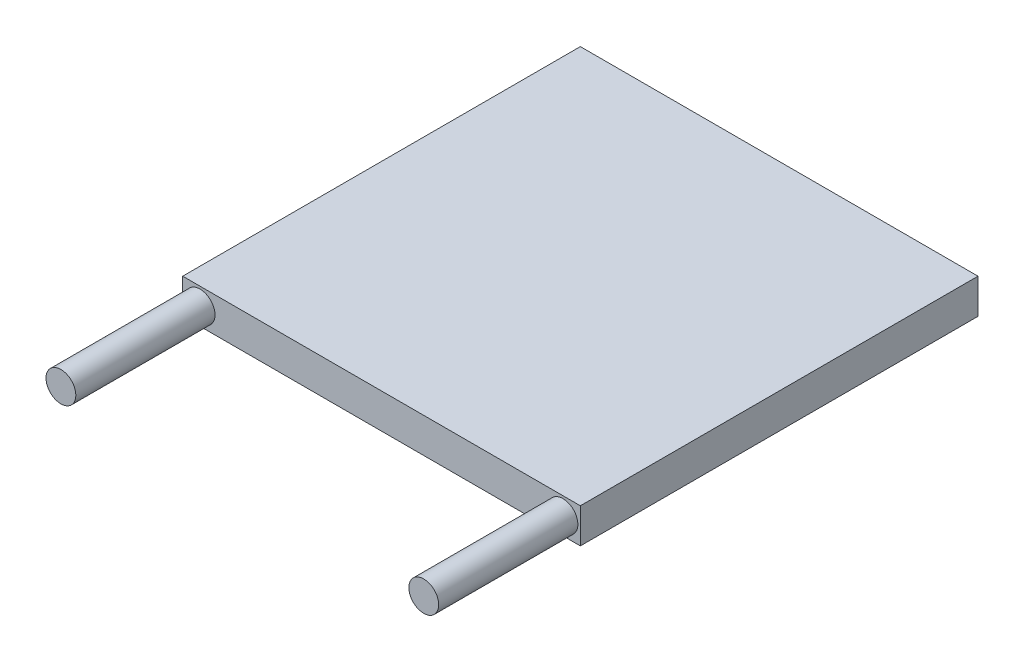
ISO-10303-21;
HEADER;
FILE_DESCRIPTION(('STEP AP214'),'2;1');
FILE_NAME('part.step','',(''),(''),'','','');
FILE_SCHEMA(('AUTOMOTIVE_DESIGN { 1 0 10303 214 1 1 1 1 }'));
ENDSEC;
DATA;
#1=APPLICATION_CONTEXT('core data for automotive mechanical design processes');
#2=APPLICATION_PROTOCOL_DEFINITION('international standard','automotive_design',2000,#1);
#3=PRODUCT_CONTEXT('',#1,'mechanical');
#4=PRODUCT('Part','Part','',(#3));
#5=PRODUCT_RELATED_PRODUCT_CATEGORY('part','',(#4));
#6=PRODUCT_DEFINITION_FORMATION('','',#4);
#7=PRODUCT_DEFINITION_CONTEXT('part definition',#1,'design');
#8=PRODUCT_DEFINITION('design','',#6,#7);
#9=PRODUCT_DEFINITION_SHAPE('','',#8);
#10=(LENGTH_UNIT() NAMED_UNIT(*) SI_UNIT(.MILLI.,.METRE.));
#11=(NAMED_UNIT(*) PLANE_ANGLE_UNIT() SI_UNIT($,.RADIAN.));
#12=(NAMED_UNIT(*) SI_UNIT($,.STERADIAN.) SOLID_ANGLE_UNIT());
#13=UNCERTAINTY_MEASURE_WITH_UNIT(LENGTH_MEASURE(1.E-05),#10,'distance_accuracy_value','');
#14=(GEOMETRIC_REPRESENTATION_CONTEXT(3) GLOBAL_UNCERTAINTY_ASSIGNED_CONTEXT((#13)) GLOBAL_UNIT_ASSIGNED_CONTEXT((#10,
#11,#12)) REPRESENTATION_CONTEXT('',''));
#15=CARTESIAN_POINT('',(0.,0.,0.));
#16=DIRECTION('',(0.,0.,1.));
#17=DIRECTION('',(1.,0.,0.));
#18=AXIS2_PLACEMENT_3D('',#15,#16,#17);
#19=CARTESIAN_POINT('',(20.,3.5,20.));
#20=DIRECTION('',(-1.,0.,0.));
#21=DIRECTION('',(0.,0.,1.));
#22=AXIS2_PLACEMENT_3D('',#19,#20,#21);
#23=PLANE('',#22);
#24=DIRECTION('',(0.,0.,-1.));
#25=VECTOR('',#24,1.);
#26=CARTESIAN_POINT('',(20.,0.,20.));
#27=LINE('',#26,#25);
#28=CARTESIAN_POINT('',(20.,0.,20.));
#29=VERTEX_POINT('',#28);
#30=CARTESIAN_POINT('',(20.,0.,-20.));
#31=VERTEX_POINT('',#30);
#32=EDGE_CURVE('E114',#29,#31,#27,.T.);
#33=ORIENTED_EDGE('',*,*,#32,.T.);
#34=DIRECTION('',(0.,-1.,0.));
#35=VECTOR('',#34,1.);
#36=CARTESIAN_POINT('',(20.,3.5,-20.));
#37=LINE('',#36,#35);
#38=CARTESIAN_POINT('',(20.,3.5,-20.));
#39=VERTEX_POINT('',#38);
#40=EDGE_CURVE('E52',#39,#31,#37,.T.);
#41=ORIENTED_EDGE('',*,*,#40,.F.);
#42=DIRECTION('',(0.,0.,-1.));
#43=VECTOR('',#42,1.);
#44=CARTESIAN_POINT('',(20.,3.5,20.));
#45=LINE('',#44,#43);
#46=CARTESIAN_POINT('',(20.,3.5,20.));
#47=VERTEX_POINT('',#46);
#48=EDGE_CURVE('E96',#47,#39,#45,.T.);
#49=ORIENTED_EDGE('',*,*,#48,.F.);
#50=DIRECTION('',(0.,-1.,0.));
#51=VECTOR('',#50,1.);
#52=CARTESIAN_POINT('',(20.,3.5,20.));
#53=LINE('',#52,#51);
#54=EDGE_CURVE('E110',#47,#29,#53,.T.);
#55=ORIENTED_EDGE('',*,*,#54,.T.);
#56=EDGE_LOOP('',(#33,#41,#49,#55));
#57=FACE_BOUND('',#56,.T.);
#58=ADVANCED_FACE('F43',(#57),#23,.F.);
#59=CARTESIAN_POINT('',(-20.,3.5,-20.));
#60=DIRECTION('',(0.,0.,1.));
#61=DIRECTION('',(1.,0.,0.));
#62=AXIS2_PLACEMENT_3D('',#59,#60,#61);
#63=PLANE('',#62);
#64=DIRECTION('',(-1.,0.,0.));
#65=VECTOR('',#64,1.);
#66=CARTESIAN_POINT('',(-20.,0.,-20.));
#67=LINE('',#66,#65);
#68=CARTESIAN_POINT('',(-20.,0.,-20.));
#69=VERTEX_POINT('',#68);
#70=EDGE_CURVE('E102',#31,#69,#67,.T.);
#71=ORIENTED_EDGE('',*,*,#70,.T.);
#72=DIRECTION('',(0.,-1.,0.));
#73=VECTOR('',#72,1.);
#74=CARTESIAN_POINT('',(-20.,3.5,-20.));
#75=LINE('',#74,#73);
#76=CARTESIAN_POINT('',(-20.,3.5,-20.));
#77=VERTEX_POINT('',#76);
#78=EDGE_CURVE('E100',#77,#69,#75,.T.);
#79=ORIENTED_EDGE('',*,*,#78,.F.);
#80=DIRECTION('',(-1.,0.,0.));
#81=VECTOR('',#80,1.);
#82=CARTESIAN_POINT('',(-20.,3.5,-20.));
#83=LINE('',#82,#81);
#84=EDGE_CURVE('E91',#39,#77,#83,.T.);
#85=ORIENTED_EDGE('',*,*,#84,.F.);
#86=ORIENTED_EDGE('',*,*,#40,.T.);
#87=EDGE_LOOP('',(#71,#79,#85,#86));
#88=FACE_BOUND('',#87,.T.);
#89=ADVANCED_FACE('F101',(#88),#63,.F.);
#90=CARTESIAN_POINT('',(-20.,3.5,20.));
#91=DIRECTION('',(1.,0.,0.));
#92=DIRECTION('',(0.,0.,-1.));
#93=AXIS2_PLACEMENT_3D('',#90,#91,#92);
#94=PLANE('',#93);
#95=DIRECTION('',(0.,0.,1.));
#96=VECTOR('',#95,1.);
#97=CARTESIAN_POINT('',(-20.,0.,20.));
#98=LINE('',#97,#96);
#99=CARTESIAN_POINT('',(-20.,0.,20.));
#100=VERTEX_POINT('',#99);
#101=EDGE_CURVE('E77',#69,#100,#98,.T.);
#102=ORIENTED_EDGE('',*,*,#101,.T.);
#103=DIRECTION('',(0.,-1.,0.));
#104=VECTOR('',#103,1.);
#105=CARTESIAN_POINT('',(-20.,3.5,20.));
#106=LINE('',#105,#104);
#107=CARTESIAN_POINT('',(-20.,3.5,20.));
#108=VERTEX_POINT('',#107);
#109=EDGE_CURVE('E104',#108,#100,#106,.T.);
#110=ORIENTED_EDGE('',*,*,#109,.F.);
#111=DIRECTION('',(0.,0.,1.));
#112=VECTOR('',#111,1.);
#113=CARTESIAN_POINT('',(-20.,3.5,20.));
#114=LINE('',#113,#112);
#115=EDGE_CURVE('E94',#77,#108,#114,.T.);
#116=ORIENTED_EDGE('',*,*,#115,.F.);
#117=ORIENTED_EDGE('',*,*,#78,.T.);
#118=EDGE_LOOP('',(#102,#110,#116,#117));
#119=FACE_BOUND('',#118,.T.);
#120=ADVANCED_FACE('F106',(#119),#94,.F.);
#121=CARTESIAN_POINT('',(-20.,3.5,20.));
#122=DIRECTION('',(0.,0.,-1.));
#123=DIRECTION('',(-1.,0.,0.));
#124=AXIS2_PLACEMENT_3D('',#121,#122,#123);
#125=PLANE('',#124);
#126=CARTESIAN_POINT('',(-18.25,1.75,20.));
#127=DIRECTION('',(0.,0.,-1.));
#128=DIRECTION('',(-1.,0.,0.));
#129=AXIS2_PLACEMENT_3D('',#126,#127,#128);
#130=CIRCLE('',#129,1.5);
#131=CARTESIAN_POINT('',(-19.75,1.75,20.));
#132=VERTEX_POINT('',#131);
#133=EDGE_CURVE('E11',#132,#132,#130,.F.);
#134=ORIENTED_EDGE('',*,*,#133,.F.);
#135=EDGE_LOOP('',(#134));
#136=FACE_BOUND('',#135,.T.);
#137=CARTESIAN_POINT('',(18.25,1.75,20.));
#138=DIRECTION('',(0.,0.,1.));
#139=DIRECTION('',(1.,0.,0.));
#140=AXIS2_PLACEMENT_3D('',#137,#138,#139);
#141=CIRCLE('',#140,1.5);
#142=CARTESIAN_POINT('',(19.75,1.75,20.));
#143=VERTEX_POINT('',#142);
#144=EDGE_CURVE('E162',#143,#143,#141,.F.);
#145=ORIENTED_EDGE('',*,*,#144,.T.);
#146=EDGE_LOOP('',(#145));
#147=FACE_BOUND('',#146,.T.);
#148=DIRECTION('',(1.,0.,0.));
#149=VECTOR('',#148,1.);
#150=CARTESIAN_POINT('',(-20.,0.,20.));
#151=LINE('',#150,#149);
#152=EDGE_CURVE('E83',#100,#29,#151,.T.);
#153=ORIENTED_EDGE('',*,*,#152,.T.);
#154=ORIENTED_EDGE('',*,*,#54,.F.);
#155=DIRECTION('',(1.,0.,0.));
#156=VECTOR('',#155,1.);
#157=CARTESIAN_POINT('',(-20.,3.5,20.));
#158=LINE('',#157,#156);
#159=EDGE_CURVE('E60',#108,#47,#158,.T.);
#160=ORIENTED_EDGE('',*,*,#159,.F.);
#161=ORIENTED_EDGE('',*,*,#109,.T.);
#162=EDGE_LOOP('',(#153,#154,#160,#161));
#163=FACE_BOUND('',#162,.T.);
#164=ADVANCED_FACE('F143',(#136,#147,#163),#125,.F.);
#165=CARTESIAN_POINT('',(0.,3.5,0.));
#166=DIRECTION('',(0.,-1.,0.));
#167=DIRECTION('',(0.,0.,-1.));
#168=AXIS2_PLACEMENT_3D('',#165,#166,#167);
#169=PLANE('',#168);
#170=ORIENTED_EDGE('',*,*,#48,.T.);
#171=ORIENTED_EDGE('',*,*,#84,.T.);
#172=ORIENTED_EDGE('',*,*,#115,.T.);
#173=ORIENTED_EDGE('',*,*,#159,.T.);
#174=EDGE_LOOP('',(#170,#171,#172,#173));
#175=FACE_BOUND('',#174,.T.);
#176=ADVANCED_FACE('F92',(#175),#169,.F.);
#177=CARTESIAN_POINT('',(0.,0.,0.));
#178=DIRECTION('',(0.,-1.,0.));
#179=DIRECTION('',(0.,0.,-1.));
#180=AXIS2_PLACEMENT_3D('',#177,#178,#179);
#181=PLANE('',#180);
#182=ORIENTED_EDGE('',*,*,#32,.F.);
#183=ORIENTED_EDGE('',*,*,#152,.F.);
#184=ORIENTED_EDGE('',*,*,#101,.F.);
#185=ORIENTED_EDGE('',*,*,#70,.F.);
#186=EDGE_LOOP('',(#182,#183,#184,#185));
#187=FACE_BOUND('',#186,.T.);
#188=ADVANCED_FACE('F132',(#187),#181,.T.);
#189=CARTESIAN_POINT('',(18.25,1.75,34.));
#190=DIRECTION('',(0.,0.,-1.));
#191=DIRECTION('',(-1.,0.,0.));
#192=AXIS2_PLACEMENT_3D('',#189,#190,#191);
#193=CYLINDRICAL_SURFACE('',#192,1.5);
#194=CARTESIAN_POINT('',(18.25,1.75,34.));
#195=DIRECTION('',(0.,0.,1.));
#196=DIRECTION('',(1.,0.,0.));
#197=AXIS2_PLACEMENT_3D('',#194,#195,#196);
#198=CIRCLE('',#197,1.5);
#199=CARTESIAN_POINT('',(19.75,1.75,34.));
#200=VERTEX_POINT('',#199);
#201=EDGE_CURVE('E118',#200,#200,#198,.F.);
#202=ORIENTED_EDGE('',*,*,#201,.T.);
#203=EDGE_LOOP('',(#202));
#204=FACE_BOUND('',#203,.T.);
#205=ORIENTED_EDGE('',*,*,#144,.F.);
#206=EDGE_LOOP('',(#205));
#207=FACE_BOUND('',#206,.T.);
#208=ADVANCED_FACE('F134',(#204,#207),#193,.T.);
#209=CARTESIAN_POINT('',(0.,0.,34.));
#210=DIRECTION('',(0.,0.,1.));
#211=DIRECTION('',(1.,0.,0.));
#212=AXIS2_PLACEMENT_3D('',#209,#210,#211);
#213=PLANE('',#212);
#214=ORIENTED_EDGE('',*,*,#201,.F.);
#215=EDGE_LOOP('',(#214));
#216=FACE_BOUND('',#215,.T.);
#217=ADVANCED_FACE('F140',(#216),#213,.T.);
#218=CARTESIAN_POINT('',(-18.25,1.75,34.));
#219=DIRECTION('',(0.,0.,-1.));
#220=DIRECTION('',(-1.,0.,0.));
#221=AXIS2_PLACEMENT_3D('',#218,#219,#220);
#222=CYLINDRICAL_SURFACE('',#221,1.5);
#223=CARTESIAN_POINT('',(-18.25,1.75,34.));
#224=DIRECTION('',(0.,0.,1.));
#225=DIRECTION('',(1.,0.,0.));
#226=AXIS2_PLACEMENT_3D('',#223,#224,#225);
#227=CIRCLE('',#226,1.5);
#228=CARTESIAN_POINT('',(-16.75,1.75,34.));
#229=VERTEX_POINT('',#228);
#230=EDGE_CURVE('E165',#229,#229,#227,.T.);
#231=ORIENTED_EDGE('',*,*,#230,.F.);
#232=EDGE_LOOP('',(#231));
#233=FACE_BOUND('',#232,.T.);
#234=ORIENTED_EDGE('',*,*,#133,.T.);
#235=EDGE_LOOP('',(#234));
#236=FACE_BOUND('',#235,.T.);
#237=ADVANCED_FACE('F178',(#233,#236),#222,.T.);
#238=CARTESIAN_POINT('',(0.,0.,34.));
#239=DIRECTION('',(0.,0.,1.));
#240=DIRECTION('',(1.,0.,0.));
#241=AXIS2_PLACEMENT_3D('',#238,#239,#240);
#242=PLANE('',#241);
#243=ORIENTED_EDGE('',*,*,#230,.T.);
#244=EDGE_LOOP('',(#243));
#245=FACE_BOUND('',#244,.T.);
#246=ADVANCED_FACE('F176',(#245),#242,.T.);
#247=CLOSED_SHELL('',(#58,#89,#120,#164,#176,#188,#208,#217,#237,#246));
#248=MANIFOLD_SOLID_BREP('B2',#247);
#249=ADVANCED_BREP_SHAPE_REPRESENTATION('',(#18,#248),#14);
#250=SHAPE_DEFINITION_REPRESENTATION(#9,#249);
ENDSEC;
END-ISO-10303-21;
